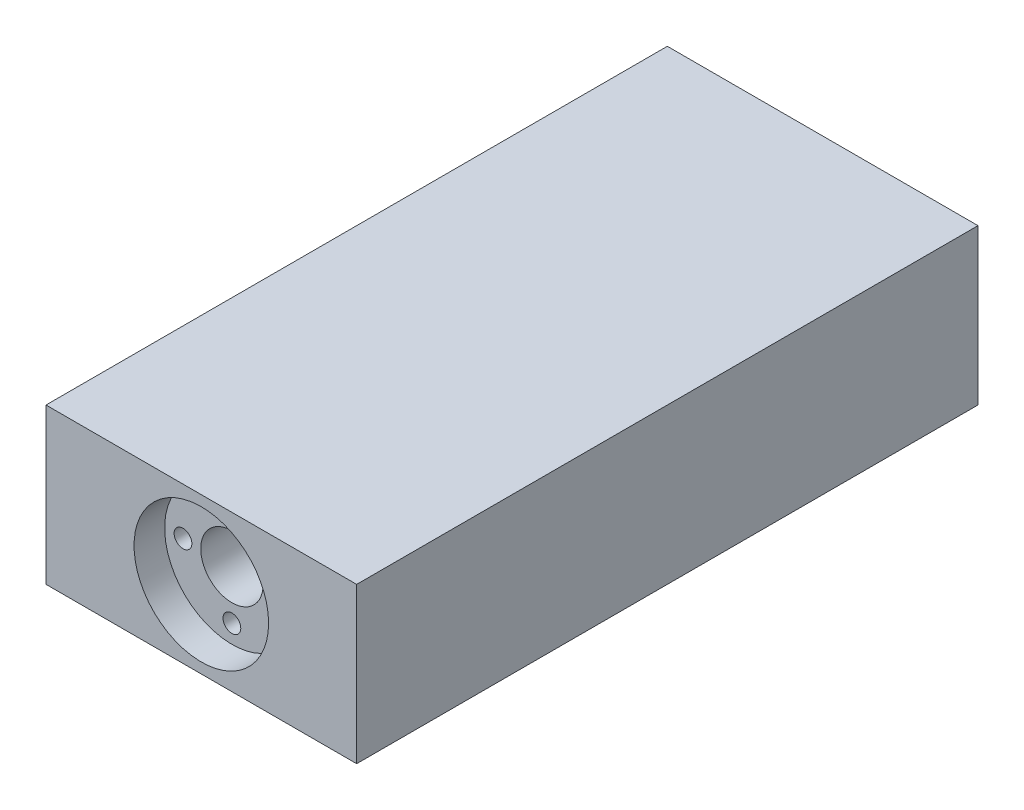
ISO-10303-21;
HEADER;
FILE_DESCRIPTION(('STEP AP214'),'2;1');
FILE_NAME('part.step','',(''),(''),'','','');
FILE_SCHEMA(('AUTOMOTIVE_DESIGN { 1 0 10303 214 1 1 1 1 }'));
ENDSEC;
DATA;
#1=APPLICATION_CONTEXT('core data for automotive mechanical design processes');
#2=APPLICATION_PROTOCOL_DEFINITION('international standard','automotive_design',2000,#1);
#3=PRODUCT_CONTEXT('',#1,'mechanical');
#4=PRODUCT('Part','Part','',(#3));
#5=PRODUCT_RELATED_PRODUCT_CATEGORY('part','',(#4));
#6=PRODUCT_DEFINITION_FORMATION('','',#4);
#7=PRODUCT_DEFINITION_CONTEXT('part definition',#1,'design');
#8=PRODUCT_DEFINITION('design','',#6,#7);
#9=PRODUCT_DEFINITION_SHAPE('','',#8);
#10=(LENGTH_UNIT() NAMED_UNIT(*) SI_UNIT(.MILLI.,.METRE.));
#11=(NAMED_UNIT(*) PLANE_ANGLE_UNIT() SI_UNIT($,.RADIAN.));
#12=(NAMED_UNIT(*) SI_UNIT($,.STERADIAN.) SOLID_ANGLE_UNIT());
#13=UNCERTAINTY_MEASURE_WITH_UNIT(LENGTH_MEASURE(1.E-05),#10,'distance_accuracy_value','');
#14=(GEOMETRIC_REPRESENTATION_CONTEXT(3) GLOBAL_UNCERTAINTY_ASSIGNED_CONTEXT((#13)) GLOBAL_UNIT_ASSIGNED_CONTEXT((#10,
#11,#12)) REPRESENTATION_CONTEXT('',''));
#15=CARTESIAN_POINT('',(0.,0.,0.));
#16=DIRECTION('',(0.,0.,1.));
#17=DIRECTION('',(1.,0.,0.));
#18=AXIS2_PLACEMENT_3D('',#15,#16,#17);
#19=CARTESIAN_POINT('',(0.,0.,101.6));
#20=DIRECTION('',(1.,0.,0.));
#21=DIRECTION('',(0.,1.,0.));
#22=AXIS2_PLACEMENT_3D('',#19,#20,#21);
#23=PLANE('',#22);
#24=DIRECTION('',(0.,-1.,0.));
#25=VECTOR('',#24,1.);
#26=CARTESIAN_POINT('',(0.,0.,0.));
#27=LINE('',#26,#25);
#28=CARTESIAN_POINT('',(0.,25.4,0.));
#29=VERTEX_POINT('',#28);
#30=CARTESIAN_POINT('',(0.,0.,0.));
#31=VERTEX_POINT('',#30);
#32=EDGE_CURVE('E143',#29,#31,#27,.T.);
#33=ORIENTED_EDGE('',*,*,#32,.T.);
#34=DIRECTION('',(0.,0.,-1.));
#35=VECTOR('',#34,1.);
#36=CARTESIAN_POINT('',(0.,0.,101.6));
#37=LINE('',#36,#35);
#38=CARTESIAN_POINT('',(0.,0.,101.6));
#39=VERTEX_POINT('',#38);
#40=EDGE_CURVE('E11',#39,#31,#37,.T.);
#41=ORIENTED_EDGE('',*,*,#40,.F.);
#42=DIRECTION('',(0.,-1.,0.));
#43=VECTOR('',#42,1.);
#44=CARTESIAN_POINT('',(0.,0.,101.6));
#45=LINE('',#44,#43);
#46=CARTESIAN_POINT('',(0.,25.4,101.6));
#47=VERTEX_POINT('',#46);
#48=EDGE_CURVE('E146',#47,#39,#45,.T.);
#49=ORIENTED_EDGE('',*,*,#48,.F.);
#50=DIRECTION('',(0.,0.,-1.));
#51=VECTOR('',#50,1.);
#52=CARTESIAN_POINT('',(0.,25.4,101.6));
#53=LINE('',#52,#51);
#54=EDGE_CURVE('E152',#47,#29,#53,.T.);
#55=ORIENTED_EDGE('',*,*,#54,.T.);
#56=EDGE_LOOP('',(#33,#41,#49,#55));
#57=FACE_BOUND('',#56,.T.);
#58=ADVANCED_FACE('F40',(#57),#23,.F.);
#59=CARTESIAN_POINT('',(0.,0.,101.6));
#60=DIRECTION('',(0.,1.,0.));
#61=DIRECTION('',(0.,0.,1.));
#62=AXIS2_PLACEMENT_3D('',#59,#60,#61);
#63=PLANE('',#62);
#64=DIRECTION('',(1.,0.,0.));
#65=VECTOR('',#64,1.);
#66=CARTESIAN_POINT('',(0.,0.,0.));
#67=LINE('',#66,#65);
#68=CARTESIAN_POINT('',(50.8,0.,0.));
#69=VERTEX_POINT('',#68);
#70=EDGE_CURVE('E155',#31,#69,#67,.T.);
#71=ORIENTED_EDGE('',*,*,#70,.T.);
#72=DIRECTION('',(0.,0.,-1.));
#73=VECTOR('',#72,1.);
#74=CARTESIAN_POINT('',(50.8,0.,101.6));
#75=LINE('',#74,#73);
#76=CARTESIAN_POINT('',(50.8,0.,101.6));
#77=VERTEX_POINT('',#76);
#78=EDGE_CURVE('E48',#77,#69,#75,.T.);
#79=ORIENTED_EDGE('',*,*,#78,.F.);
#80=DIRECTION('',(1.,0.,0.));
#81=VECTOR('',#80,1.);
#82=CARTESIAN_POINT('',(0.,0.,101.6));
#83=LINE('',#82,#81);
#84=EDGE_CURVE('E87',#39,#77,#83,.T.);
#85=ORIENTED_EDGE('',*,*,#84,.F.);
#86=ORIENTED_EDGE('',*,*,#40,.T.);
#87=EDGE_LOOP('',(#71,#79,#85,#86));
#88=FACE_BOUND('',#87,.T.);
#89=ADVANCED_FACE('F179',(#88),#63,.F.);
#90=CARTESIAN_POINT('',(50.8,0.,101.6));
#91=DIRECTION('',(-1.,0.,0.));
#92=DIRECTION('',(0.,-1.,0.));
#93=AXIS2_PLACEMENT_3D('',#90,#91,#92);
#94=PLANE('',#93);
#95=DIRECTION('',(0.,1.,0.));
#96=VECTOR('',#95,1.);
#97=CARTESIAN_POINT('',(50.8,0.,0.));
#98=LINE('',#97,#96);
#99=CARTESIAN_POINT('',(50.8,25.4,0.));
#100=VERTEX_POINT('',#99);
#101=EDGE_CURVE('E74',#69,#100,#98,.T.);
#102=ORIENTED_EDGE('',*,*,#101,.T.);
#103=DIRECTION('',(0.,0.,-1.));
#104=VECTOR('',#103,1.);
#105=CARTESIAN_POINT('',(50.8,25.4,101.6));
#106=LINE('',#105,#104);
#107=CARTESIAN_POINT('',(50.8,25.4,101.6));
#108=VERTEX_POINT('',#107);
#109=EDGE_CURVE('E160',#108,#100,#106,.T.);
#110=ORIENTED_EDGE('',*,*,#109,.F.);
#111=DIRECTION('',(0.,1.,0.));
#112=VECTOR('',#111,1.);
#113=CARTESIAN_POINT('',(50.8,0.,101.6));
#114=LINE('',#113,#112);
#115=EDGE_CURVE('E149',#77,#108,#114,.T.);
#116=ORIENTED_EDGE('',*,*,#115,.F.);
#117=ORIENTED_EDGE('',*,*,#78,.T.);
#118=EDGE_LOOP('',(#102,#110,#116,#117));
#119=FACE_BOUND('',#118,.T.);
#120=ADVANCED_FACE('F162',(#119),#94,.F.);
#121=CARTESIAN_POINT('',(0.,25.4,101.6));
#122=DIRECTION('',(0.,-1.,0.));
#123=DIRECTION('',(0.,0.,-1.));
#124=AXIS2_PLACEMENT_3D('',#121,#122,#123);
#125=PLANE('',#124);
#126=DIRECTION('',(-1.,0.,0.));
#127=VECTOR('',#126,1.);
#128=CARTESIAN_POINT('',(0.,25.4,0.));
#129=LINE('',#128,#127);
#130=EDGE_CURVE('E80',#100,#29,#129,.T.);
#131=ORIENTED_EDGE('',*,*,#130,.T.);
#132=ORIENTED_EDGE('',*,*,#54,.F.);
#133=DIRECTION('',(-1.,0.,0.));
#134=VECTOR('',#133,1.);
#135=CARTESIAN_POINT('',(0.,25.4,101.6));
#136=LINE('',#135,#134);
#137=EDGE_CURVE('E56',#108,#47,#136,.T.);
#138=ORIENTED_EDGE('',*,*,#137,.F.);
#139=ORIENTED_EDGE('',*,*,#109,.T.);
#140=EDGE_LOOP('',(#131,#132,#138,#139));
#141=FACE_BOUND('',#140,.T.);
#142=ADVANCED_FACE('F169',(#141),#125,.F.);
#143=CARTESIAN_POINT('',(0.,0.,101.6));
#144=DIRECTION('',(0.,0.,-1.));
#145=DIRECTION('',(-1.,0.,0.));
#146=AXIS2_PLACEMENT_3D('',#143,#144,#145);
#147=PLANE('',#146);
#148=CARTESIAN_POINT('',(25.4,12.7,101.6));
#149=DIRECTION('',(0.,0.,1.));
#150=DIRECTION('',(1.,0.,0.));
#151=AXIS2_PLACEMENT_3D('',#148,#149,#150);
#152=CIRCLE('',#151,10.999999971);
#153=CARTESIAN_POINT('',(36.399999971,12.7,101.6));
#154=VERTEX_POINT('',#153);
#155=EDGE_CURVE('E137',#154,#154,#152,.T.);
#156=ORIENTED_EDGE('',*,*,#155,.F.);
#157=EDGE_LOOP('',(#156));
#158=FACE_BOUND('',#157,.T.);
#159=ORIENTED_EDGE('',*,*,#48,.T.);
#160=ORIENTED_EDGE('',*,*,#84,.T.);
#161=ORIENTED_EDGE('',*,*,#115,.T.);
#162=ORIENTED_EDGE('',*,*,#137,.T.);
#163=EDGE_LOOP('',(#159,#160,#161,#162));
#164=FACE_BOUND('',#163,.T.);
#165=ADVANCED_FACE('F171',(#158,#164),#147,.F.);
#166=CARTESIAN_POINT('',(0.,0.,0.));
#167=DIRECTION('',(0.,0.,-1.));
#168=DIRECTION('',(-1.,0.,0.));
#169=AXIS2_PLACEMENT_3D('',#166,#167,#168);
#170=PLANE('',#169);
#171=CARTESIAN_POINT('',(25.4,12.7,0.));
#172=DIRECTION('',(0.,0.,1.));
#173=DIRECTION('',(1.,0.,0.));
#174=AXIS2_PLACEMENT_3D('',#171,#172,#173);
#175=CIRCLE('',#174,5.09999996);
#176=CARTESIAN_POINT('',(30.49999996,12.7,0.));
#177=VERTEX_POINT('',#176);
#178=EDGE_CURVE('E134',#177,#177,#175,.T.);
#179=ORIENTED_EDGE('',*,*,#178,.T.);
#180=EDGE_LOOP('',(#179));
#181=FACE_BOUND('',#180,.T.);
#182=ORIENTED_EDGE('',*,*,#32,.F.);
#183=ORIENTED_EDGE('',*,*,#130,.F.);
#184=ORIENTED_EDGE('',*,*,#101,.F.);
#185=ORIENTED_EDGE('',*,*,#70,.F.);
#186=EDGE_LOOP('',(#182,#183,#184,#185));
#187=FACE_BOUND('',#186,.T.);
#188=ADVANCED_FACE('F165',(#181,#187),#170,.T.);
#189=CARTESIAN_POINT('',(25.4,12.7,96.600000094));
#190=DIRECTION('',(0.,0.,1.));
#191=DIRECTION('',(1.,0.,0.));
#192=AXIS2_PLACEMENT_3D('',#189,#190,#191);
#193=CYLINDRICAL_SURFACE('',#192,10.999999971);
#194=CARTESIAN_POINT('',(25.4,12.7,96.600000094));
#195=DIRECTION('',(0.,0.,1.));
#196=DIRECTION('',(1.,0.,0.));
#197=AXIS2_PLACEMENT_3D('',#194,#195,#196);
#198=CIRCLE('',#197,10.999999971);
#199=CARTESIAN_POINT('',(36.399999971,12.7,96.600000094));
#200=VERTEX_POINT('',#199);
#201=EDGE_CURVE('E140',#200,#200,#198,.T.);
#202=ORIENTED_EDGE('',*,*,#201,.F.);
#203=EDGE_LOOP('',(#202));
#204=FACE_BOUND('',#203,.T.);
#205=ORIENTED_EDGE('',*,*,#155,.T.);
#206=EDGE_LOOP('',(#205));
#207=FACE_BOUND('',#206,.T.);
#208=ADVANCED_FACE('F209',(#204,#207),#193,.F.);
#209=CARTESIAN_POINT('',(25.4,12.7,96.600000094));
#210=DIRECTION('',(0.,0.,1.));
#211=DIRECTION('',(1.,0.,0.));
#212=AXIS2_PLACEMENT_3D('',#209,#210,#211);
#213=PLANE('',#212);
#214=CARTESIAN_POINT('',(25.4,20.6999967,96.600000094));
#215=DIRECTION('',(0.,0.,1.));
#216=DIRECTION('',(1.,0.,0.));
#217=AXIS2_PLACEMENT_3D('',#214,#215,#216);
#218=CIRCLE('',#217,1.44999999999999);
#219=CARTESIAN_POINT('',(26.85,20.6999967,96.600000094));
#220=VERTEX_POINT('',#219);
#221=EDGE_CURVE('E111',#220,#220,#218,.T.);
#222=ORIENTED_EDGE('',*,*,#221,.F.);
#223=EDGE_LOOP('',(#222));
#224=FACE_BOUND('',#223,.T.);
#225=CARTESIAN_POINT('',(17.4000033,12.7,96.600000094));
#226=DIRECTION('',(0.,0.,1.));
#227=DIRECTION('',(1.,0.,0.));
#228=AXIS2_PLACEMENT_3D('',#225,#226,#227);
#229=CIRCLE('',#228,1.44999999999999);
#230=CARTESIAN_POINT('',(18.8500033,12.7,96.600000094));
#231=VERTEX_POINT('',#230);
#232=EDGE_CURVE('E110',#231,#231,#229,.T.);
#233=ORIENTED_EDGE('',*,*,#232,.F.);
#234=EDGE_LOOP('',(#233));
#235=FACE_BOUND('',#234,.T.);
#236=CARTESIAN_POINT('',(25.4,4.7000033,96.600000094));
#237=DIRECTION('',(0.,0.,1.));
#238=DIRECTION('',(1.,0.,0.));
#239=AXIS2_PLACEMENT_3D('',#236,#237,#238);
#240=CIRCLE('',#239,1.44999999999999);
#241=CARTESIAN_POINT('',(26.85,4.7000033,96.600000094));
#242=VERTEX_POINT('',#241);
#243=EDGE_CURVE('E121',#242,#242,#240,.T.);
#244=ORIENTED_EDGE('',*,*,#243,.F.);
#245=EDGE_LOOP('',(#244));
#246=FACE_BOUND('',#245,.T.);
#247=CARTESIAN_POINT('',(33.3999967,12.7,96.600000094));
#248=DIRECTION('',(0.,0.,1.));
#249=DIRECTION('',(1.,0.,0.));
#250=AXIS2_PLACEMENT_3D('',#247,#248,#249);
#251=CIRCLE('',#250,1.44999999999999);
#252=CARTESIAN_POINT('',(34.8499967,12.7,96.600000094));
#253=VERTEX_POINT('',#252);
#254=EDGE_CURVE('E127',#253,#253,#251,.T.);
#255=ORIENTED_EDGE('',*,*,#254,.F.);
#256=EDGE_LOOP('',(#255));
#257=FACE_BOUND('',#256,.T.);
#258=CARTESIAN_POINT('',(25.4,12.7,96.600000094));
#259=DIRECTION('',(0.,0.,1.));
#260=DIRECTION('',(1.,0.,0.));
#261=AXIS2_PLACEMENT_3D('',#258,#259,#260);
#262=CIRCLE('',#261,5.09999996);
#263=CARTESIAN_POINT('',(30.49999996,12.7,96.600000094));
#264=VERTEX_POINT('',#263);
#265=EDGE_CURVE('E133',#264,#264,#262,.T.);
#266=ORIENTED_EDGE('',*,*,#265,.F.);
#267=EDGE_LOOP('',(#266));
#268=FACE_BOUND('',#267,.T.);
#269=ORIENTED_EDGE('',*,*,#201,.T.);
#270=EDGE_LOOP('',(#269));
#271=FACE_BOUND('',#270,.T.);
#272=ADVANCED_FACE('F214',(#224,#235,#246,#257,#268,#271),#213,.T.);
#273=CARTESIAN_POINT('',(25.4,12.7,0.));
#274=DIRECTION('',(0.,0.,1.));
#275=DIRECTION('',(1.,0.,0.));
#276=AXIS2_PLACEMENT_3D('',#273,#274,#275);
#277=CYLINDRICAL_SURFACE('',#276,5.09999996);
#278=ORIENTED_EDGE('',*,*,#178,.F.);
#279=EDGE_LOOP('',(#278));
#280=FACE_BOUND('',#279,.T.);
#281=ORIENTED_EDGE('',*,*,#265,.T.);
#282=EDGE_LOOP('',(#281));
#283=FACE_BOUND('',#282,.T.);
#284=ADVANCED_FACE('F228',(#280,#283),#277,.F.);
#285=CARTESIAN_POINT('',(33.3999967,12.7,86.599994694));
#286=DIRECTION('',(0.,0.,1.));
#287=DIRECTION('',(1.,0.,0.));
#288=AXIS2_PLACEMENT_3D('',#285,#286,#287);
#289=CONICAL_SURFACE('',#288,1.45,1.02974425867665);
#290=CARTESIAN_POINT('',(33.3999967,12.7,85.72874679641));
#291=VERTEX_POINT('',#290);
#292=VERTEX_LOOP('',#291);
#293=FACE_BOUND('',#292,.T.);
#294=CARTESIAN_POINT('',(33.3999967,12.7,86.599994694));
#295=DIRECTION('',(0.,0.,1.));
#296=DIRECTION('',(1.,0.,0.));
#297=AXIS2_PLACEMENT_3D('',#294,#295,#296);
#298=CIRCLE('',#297,1.45);
#299=CARTESIAN_POINT('',(34.8499967,12.7,86.599994694));
#300=VERTEX_POINT('',#299);
#301=EDGE_CURVE('E130',#300,#300,#298,.T.);
#302=ORIENTED_EDGE('',*,*,#301,.T.);
#303=EDGE_LOOP('',(#302));
#304=FACE_BOUND('',#303,.T.);
#305=ADVANCED_FACE('F233',(#293,#304),#289,.F.);
#306=CARTESIAN_POINT('',(33.3999967,12.7,96.600000094));
#307=DIRECTION('',(0.,0.,1.));
#308=DIRECTION('',(1.,0.,0.));
#309=AXIS2_PLACEMENT_3D('',#306,#307,#308);
#310=CYLINDRICAL_SURFACE('',#309,1.45);
#311=ORIENTED_EDGE('',*,*,#301,.F.);
#312=EDGE_LOOP('',(#311));
#313=FACE_BOUND('',#312,.T.);
#314=ORIENTED_EDGE('',*,*,#254,.T.);
#315=EDGE_LOOP('',(#314));
#316=FACE_BOUND('',#315,.T.);
#317=ADVANCED_FACE('F248',(#313,#316),#310,.F.);
#318=CARTESIAN_POINT('',(25.4,4.7000033,86.599994694));
#319=DIRECTION('',(0.,0.,1.));
#320=DIRECTION('',(1.,0.,0.));
#321=AXIS2_PLACEMENT_3D('',#318,#319,#320);
#322=CONICAL_SURFACE('',#321,1.45,1.02974425867665);
#323=CARTESIAN_POINT('',(25.4,4.7000033,85.72874679641));
#324=VERTEX_POINT('',#323);
#325=VERTEX_LOOP('',#324);
#326=FACE_BOUND('',#325,.T.);
#327=CARTESIAN_POINT('',(25.4,4.7000033,86.599994694));
#328=DIRECTION('',(0.,0.,1.));
#329=DIRECTION('',(1.,0.,0.));
#330=AXIS2_PLACEMENT_3D('',#327,#328,#329);
#331=CIRCLE('',#330,1.45);
#332=CARTESIAN_POINT('',(26.85,4.7000033,86.599994694));
#333=VERTEX_POINT('',#332);
#334=EDGE_CURVE('E124',#333,#333,#331,.T.);
#335=ORIENTED_EDGE('',*,*,#334,.T.);
#336=EDGE_LOOP('',(#335));
#337=FACE_BOUND('',#336,.T.);
#338=ADVANCED_FACE('F259',(#326,#337),#322,.F.);
#339=CARTESIAN_POINT('',(25.4,4.7000033,96.600000094));
#340=DIRECTION('',(0.,0.,1.));
#341=DIRECTION('',(1.,0.,0.));
#342=AXIS2_PLACEMENT_3D('',#339,#340,#341);
#343=CYLINDRICAL_SURFACE('',#342,1.44999999999999);
#344=ORIENTED_EDGE('',*,*,#334,.F.);
#345=EDGE_LOOP('',(#344));
#346=FACE_BOUND('',#345,.T.);
#347=ORIENTED_EDGE('',*,*,#243,.T.);
#348=EDGE_LOOP('',(#347));
#349=FACE_BOUND('',#348,.T.);
#350=ADVANCED_FACE('F270',(#346,#349),#343,.F.);
#351=CARTESIAN_POINT('',(17.4000033,12.7,86.599994694));
#352=DIRECTION('',(0.,0.,1.));
#353=DIRECTION('',(1.,0.,0.));
#354=AXIS2_PLACEMENT_3D('',#351,#352,#353);
#355=CONICAL_SURFACE('',#354,1.45,1.02974425867665);
#356=CARTESIAN_POINT('',(17.4000033,12.7,85.72874679641));
#357=VERTEX_POINT('',#356);
#358=VERTEX_LOOP('',#357);
#359=FACE_BOUND('',#358,.T.);
#360=CARTESIAN_POINT('',(17.4000033,12.7,86.599994694));
#361=DIRECTION('',(0.,0.,1.));
#362=DIRECTION('',(1.,0.,0.));
#363=AXIS2_PLACEMENT_3D('',#360,#361,#362);
#364=CIRCLE('',#363,1.45);
#365=CARTESIAN_POINT('',(18.8500033,12.7,86.599994694));
#366=VERTEX_POINT('',#365);
#367=EDGE_CURVE('E114',#366,#366,#364,.T.);
#368=ORIENTED_EDGE('',*,*,#367,.T.);
#369=EDGE_LOOP('',(#368));
#370=FACE_BOUND('',#369,.T.);
#371=ADVANCED_FACE('F280',(#359,#370),#355,.F.);
#372=CARTESIAN_POINT('',(17.4000033,12.7,96.600000094));
#373=DIRECTION('',(0.,0.,1.));
#374=DIRECTION('',(1.,0.,0.));
#375=AXIS2_PLACEMENT_3D('',#372,#373,#374);
#376=CYLINDRICAL_SURFACE('',#375,1.44999999999999);
#377=ORIENTED_EDGE('',*,*,#367,.F.);
#378=EDGE_LOOP('',(#377));
#379=FACE_BOUND('',#378,.T.);
#380=ORIENTED_EDGE('',*,*,#232,.T.);
#381=EDGE_LOOP('',(#380));
#382=FACE_BOUND('',#381,.T.);
#383=ADVANCED_FACE('F104',(#379,#382),#376,.F.);
#384=CARTESIAN_POINT('',(25.4,20.6999967,86.599994694));
#385=DIRECTION('',(0.,0.,1.));
#386=DIRECTION('',(1.,0.,0.));
#387=AXIS2_PLACEMENT_3D('',#384,#385,#386);
#388=CONICAL_SURFACE('',#387,1.45,1.02974425867665);
#389=CARTESIAN_POINT('',(25.4,20.6999967,85.72874679641));
#390=VERTEX_POINT('',#389);
#391=VERTEX_LOOP('',#390);
#392=FACE_BOUND('',#391,.T.);
#393=CARTESIAN_POINT('',(25.4,20.6999967,86.599994694));
#394=DIRECTION('',(0.,0.,1.));
#395=DIRECTION('',(1.,0.,0.));
#396=AXIS2_PLACEMENT_3D('',#393,#394,#395);
#397=CIRCLE('',#396,1.45);
#398=CARTESIAN_POINT('',(26.85,20.6999967,86.599994694));
#399=VERTEX_POINT('',#398);
#400=EDGE_CURVE('E108',#399,#399,#397,.T.);
#401=ORIENTED_EDGE('',*,*,#400,.T.);
#402=EDGE_LOOP('',(#401));
#403=FACE_BOUND('',#402,.T.);
#404=ADVANCED_FACE('F100',(#392,#403),#388,.F.);
#405=CARTESIAN_POINT('',(25.4,20.6999967,96.600000094));
#406=DIRECTION('',(0.,0.,1.));
#407=DIRECTION('',(1.,0.,0.));
#408=AXIS2_PLACEMENT_3D('',#405,#406,#407);
#409=CYLINDRICAL_SURFACE('',#408,1.44999999999999);
#410=ORIENTED_EDGE('',*,*,#400,.F.);
#411=EDGE_LOOP('',(#410));
#412=FACE_BOUND('',#411,.T.);
#413=ORIENTED_EDGE('',*,*,#221,.T.);
#414=EDGE_LOOP('',(#413));
#415=FACE_BOUND('',#414,.T.);
#416=ADVANCED_FACE('F103',(#412,#415),#409,.F.);
#417=CLOSED_SHELL('',(#58,#89,#120,#142,#165,#188,#208,#272,#284,#305,#317,#338,#350,#371,#383,
#404,#416));
#418=MANIFOLD_SOLID_BREP('B2',#417);
#419=ADVANCED_BREP_SHAPE_REPRESENTATION('',(#18,#418),#14);
#420=SHAPE_DEFINITION_REPRESENTATION(#9,#419);
ENDSEC;
END-ISO-10303-21;
